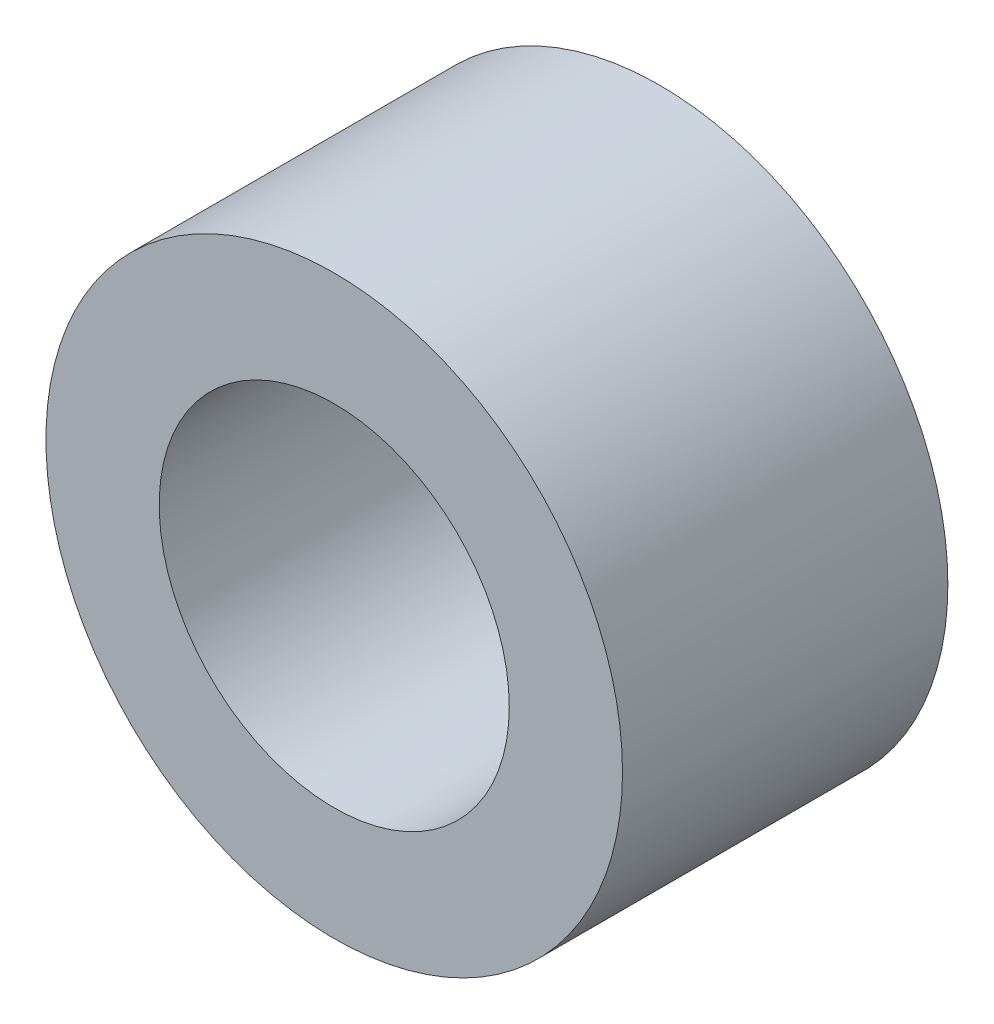
ISO-10303-21;
HEADER;
FILE_DESCRIPTION(('STEP AP214'),'2;1');
FILE_NAME('part.step','',(''),(''),'','','');
FILE_SCHEMA(('AUTOMOTIVE_DESIGN { 1 0 10303 214 1 1 1 1 }'));
ENDSEC;
DATA;
#1=APPLICATION_CONTEXT('core data for automotive mechanical design processes');
#2=APPLICATION_PROTOCOL_DEFINITION('international standard','automotive_design',2000,#1);
#3=PRODUCT_CONTEXT('',#1,'mechanical');
#4=PRODUCT('Part','Part','',(#3));
#5=PRODUCT_RELATED_PRODUCT_CATEGORY('part','',(#4));
#6=PRODUCT_DEFINITION_FORMATION('','',#4);
#7=PRODUCT_DEFINITION_CONTEXT('part definition',#1,'design');
#8=PRODUCT_DEFINITION('design','',#6,#7);
#9=PRODUCT_DEFINITION_SHAPE('','',#8);
#10=(LENGTH_UNIT() NAMED_UNIT(*) SI_UNIT(.MILLI.,.METRE.));
#11=(NAMED_UNIT(*) PLANE_ANGLE_UNIT() SI_UNIT($,.RADIAN.));
#12=(NAMED_UNIT(*) SI_UNIT($,.STERADIAN.) SOLID_ANGLE_UNIT());
#13=UNCERTAINTY_MEASURE_WITH_UNIT(LENGTH_MEASURE(1.E-05),#10,'distance_accuracy_value','');
#14=(GEOMETRIC_REPRESENTATION_CONTEXT(3) GLOBAL_UNCERTAINTY_ASSIGNED_CONTEXT((#13)) GLOBAL_UNIT_ASSIGNED_CONTEXT((#10,
#11,#12)) REPRESENTATION_CONTEXT('',''));
#15=CARTESIAN_POINT('',(0.,0.,0.));
#16=DIRECTION('',(0.,0.,1.));
#17=DIRECTION('',(1.,0.,0.));
#18=AXIS2_PLACEMENT_3D('',#15,#16,#17);
#19=CARTESIAN_POINT('',(0.,0.,7.9));
#20=DIRECTION('',(0.,0.,1.));
#21=DIRECTION('',(1.,0.,0.));
#22=AXIS2_PLACEMENT_3D('',#19,#20,#21);
#23=PLANE('',#22);
#24=CARTESIAN_POINT('',(0.,0.,7.9));
#25=DIRECTION('',(0.,0.,1.));
#26=DIRECTION('',(1.,0.,0.));
#27=AXIS2_PLACEMENT_3D('',#24,#25,#26);
#28=CIRCLE('',#27,7.);
#29=CARTESIAN_POINT('',(7.,0.,7.9));
#30=VERTEX_POINT('',#29);
#31=EDGE_CURVE('E10',#30,#30,#28,.T.);
#32=ORIENTED_EDGE('',*,*,#31,.T.);
#33=EDGE_LOOP('',(#32));
#34=FACE_BOUND('',#33,.T.);
#35=CARTESIAN_POINT('',(0.,0.,7.9));
#36=DIRECTION('',(0.,0.,1.));
#37=DIRECTION('',(1.,0.,0.));
#38=AXIS2_PLACEMENT_3D('',#35,#36,#37);
#39=CIRCLE('',#38,4.25);
#40=CARTESIAN_POINT('',(4.25,0.,7.9));
#41=VERTEX_POINT('',#40);
#42=EDGE_CURVE('E42',#41,#41,#39,.T.);
#43=ORIENTED_EDGE('',*,*,#42,.F.);
#44=EDGE_LOOP('',(#43));
#45=FACE_BOUND('',#44,.T.);
#46=ADVANCED_FACE('F31',(#34,#45),#23,.T.);
#47=CARTESIAN_POINT('',(0.,0.,0.));
#48=DIRECTION('',(0.,0.,1.));
#49=DIRECTION('',(1.,0.,0.));
#50=AXIS2_PLACEMENT_3D('',#47,#48,#49);
#51=PLANE('',#50);
#52=CARTESIAN_POINT('',(0.,0.,0.));
#53=DIRECTION('',(0.,0.,1.));
#54=DIRECTION('',(1.,0.,0.));
#55=AXIS2_PLACEMENT_3D('',#52,#53,#54);
#56=CIRCLE('',#55,7.);
#57=CARTESIAN_POINT('',(7.,0.,0.));
#58=VERTEX_POINT('',#57);
#59=EDGE_CURVE('E35',#58,#58,#56,.T.);
#60=ORIENTED_EDGE('',*,*,#59,.F.);
#61=EDGE_LOOP('',(#60));
#62=FACE_BOUND('',#61,.T.);
#63=CARTESIAN_POINT('',(0.,0.,0.));
#64=DIRECTION('',(0.,0.,1.));
#65=DIRECTION('',(1.,0.,0.));
#66=AXIS2_PLACEMENT_3D('',#63,#64,#65);
#67=CIRCLE('',#66,4.25);
#68=CARTESIAN_POINT('',(4.25,0.,0.));
#69=VERTEX_POINT('',#68);
#70=EDGE_CURVE('E44',#69,#69,#67,.T.);
#71=ORIENTED_EDGE('',*,*,#70,.T.);
#72=EDGE_LOOP('',(#71));
#73=FACE_BOUND('',#72,.T.);
#74=ADVANCED_FACE('F54',(#62,#73),#51,.F.);
#75=CARTESIAN_POINT('',(0.,0.,7.9));
#76=DIRECTION('',(0.,0.,-1.));
#77=DIRECTION('',(-1.,0.,0.));
#78=AXIS2_PLACEMENT_3D('',#75,#76,#77);
#79=CYLINDRICAL_SURFACE('',#78,7.);
#80=ORIENTED_EDGE('',*,*,#31,.F.);
#81=EDGE_LOOP('',(#80));
#82=FACE_BOUND('',#81,.T.);
#83=ORIENTED_EDGE('',*,*,#59,.T.);
#84=EDGE_LOOP('',(#83));
#85=FACE_BOUND('',#84,.T.);
#86=ADVANCED_FACE('F33',(#82,#85),#79,.T.);
#87=CARTESIAN_POINT('',(0.,0.,7.9));
#88=DIRECTION('',(0.,0.,-1.));
#89=DIRECTION('',(-1.,0.,0.));
#90=AXIS2_PLACEMENT_3D('',#87,#88,#89);
#91=CYLINDRICAL_SURFACE('',#90,4.25);
#92=ORIENTED_EDGE('',*,*,#42,.T.);
#93=EDGE_LOOP('',(#92));
#94=FACE_BOUND('',#93,.T.);
#95=ORIENTED_EDGE('',*,*,#70,.F.);
#96=EDGE_LOOP('',(#95));
#97=FACE_BOUND('',#96,.T.);
#98=ADVANCED_FACE('F50',(#94,#97),#91,.F.);
#99=CLOSED_SHELL('',(#46,#74,#86,#98));
#100=MANIFOLD_SOLID_BREP('B2',#99);
#101=ADVANCED_BREP_SHAPE_REPRESENTATION('',(#18,#100),#14);
#102=SHAPE_DEFINITION_REPRESENTATION(#9,#101);
ENDSEC;
END-ISO-10303-21;
